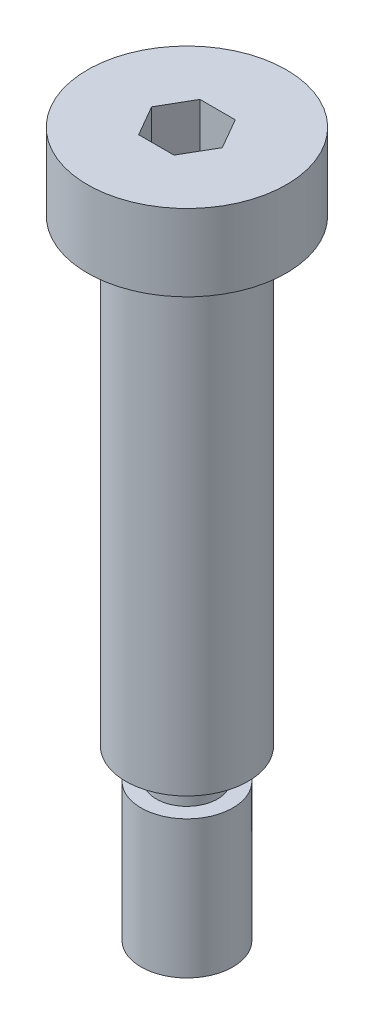
ISO-10303-21;
HEADER;
FILE_DESCRIPTION(('STEP AP214'),'2;1');
FILE_NAME('part.step','',(''),(''),'','','');
FILE_SCHEMA(('AUTOMOTIVE_DESIGN { 1 0 10303 214 1 1 1 1 }'));
ENDSEC;
DATA;
#1=APPLICATION_CONTEXT('core data for automotive mechanical design processes');
#2=APPLICATION_PROTOCOL_DEFINITION('international standard','automotive_design',2000,#1);
#3=PRODUCT_CONTEXT('',#1,'mechanical');
#4=PRODUCT('Part','Part','',(#3));
#5=PRODUCT_RELATED_PRODUCT_CATEGORY('part','',(#4));
#6=PRODUCT_DEFINITION_FORMATION('','',#4);
#7=PRODUCT_DEFINITION_CONTEXT('part definition',#1,'design');
#8=PRODUCT_DEFINITION('design','',#6,#7);
#9=PRODUCT_DEFINITION_SHAPE('','',#8);
#10=(LENGTH_UNIT() NAMED_UNIT(*) SI_UNIT(.MILLI.,.METRE.));
#11=(NAMED_UNIT(*) PLANE_ANGLE_UNIT() SI_UNIT($,.RADIAN.));
#12=(NAMED_UNIT(*) SI_UNIT($,.STERADIAN.) SOLID_ANGLE_UNIT());
#13=UNCERTAINTY_MEASURE_WITH_UNIT(LENGTH_MEASURE(1.E-05),#10,'distance_accuracy_value','');
#14=(GEOMETRIC_REPRESENTATION_CONTEXT(3) GLOBAL_UNCERTAINTY_ASSIGNED_CONTEXT((#13)) GLOBAL_UNIT_ASSIGNED_CONTEXT((#10,
#11,#12)) REPRESENTATION_CONTEXT('',''));
#15=CARTESIAN_POINT('',(0.,0.,0.));
#16=DIRECTION('',(0.,0.,1.));
#17=DIRECTION('',(1.,0.,0.));
#18=AXIS2_PLACEMENT_3D('',#15,#16,#17);
#19=CARTESIAN_POINT('',(0.,46.,0.));
#20=DIRECTION('',(0.,1.,0.));
#21=DIRECTION('',(0.,0.,1.));
#22=AXIS2_PLACEMENT_3D('',#19,#20,#21);
#23=PLANE('',#22);
#24=DIRECTION('',(-0.5,0.,-0.866025403784438));
#25=VECTOR('',#24,1.);
#26=CARTESIAN_POINT('',(2.3094010767585,46.,0.));
#27=LINE('',#26,#25);
#28=CARTESIAN_POINT('',(2.3094010767585,46.,0.));
#29=VERTEX_POINT('',#28);
#30=CARTESIAN_POINT('',(1.15470053837925,46.,-2.));
#31=VERTEX_POINT('',#30);
#32=EDGE_CURVE('E53',#29,#31,#27,.T.);
#33=ORIENTED_EDGE('',*,*,#32,.F.);
#34=DIRECTION('',(0.5,0.,-0.866025403784439));
#35=VECTOR('',#34,1.);
#36=CARTESIAN_POINT('',(1.15470053837925,46.,2.));
#37=LINE('',#36,#35);
#38=CARTESIAN_POINT('',(1.15470053837925,46.,2.));
#39=VERTEX_POINT('',#38);
#40=EDGE_CURVE('E136',#39,#29,#37,.T.);
#41=ORIENTED_EDGE('',*,*,#40,.F.);
#42=DIRECTION('',(1.,0.,0.));
#43=VECTOR('',#42,1.);
#44=CARTESIAN_POINT('',(-1.15470053837925,46.,2.));
#45=LINE('',#44,#43);
#46=CARTESIAN_POINT('',(-1.15470053837925,46.,2.));
#47=VERTEX_POINT('',#46);
#48=EDGE_CURVE('E134',#47,#39,#45,.T.);
#49=ORIENTED_EDGE('',*,*,#48,.F.);
#50=DIRECTION('',(0.5,0.,0.866025403784438));
#51=VECTOR('',#50,1.);
#52=CARTESIAN_POINT('',(-2.3094010767585,46.,0.));
#53=LINE('',#52,#51);
#54=CARTESIAN_POINT('',(-2.3094010767585,46.,0.));
#55=VERTEX_POINT('',#54);
#56=EDGE_CURVE('E101',#55,#47,#53,.T.);
#57=ORIENTED_EDGE('',*,*,#56,.F.);
#58=DIRECTION('',(-0.499999999999999,0.,0.866025403784439));
#59=VECTOR('',#58,1.);
#60=CARTESIAN_POINT('',(-1.15470053837925,46.,-2.));
#61=LINE('',#60,#59);
#62=CARTESIAN_POINT('',(-1.15470053837925,46.,-2.));
#63=VERTEX_POINT('',#62);
#64=EDGE_CURVE('E130',#63,#55,#61,.T.);
#65=ORIENTED_EDGE('',*,*,#64,.F.);
#66=DIRECTION('',(-1.,0.,0.));
#67=VECTOR('',#66,1.);
#68=CARTESIAN_POINT('',(1.15470053837925,46.,-2.));
#69=LINE('',#68,#67);
#70=EDGE_CURVE('E127',#31,#63,#69,.T.);
#71=ORIENTED_EDGE('',*,*,#70,.F.);
#72=EDGE_LOOP('',(#33,#41,#49,#57,#65,#71));
#73=FACE_BOUND('',#72,.T.);
#74=CARTESIAN_POINT('',(0.,46.,0.));
#75=DIRECTION('',(0.,-1.,0.));
#76=DIRECTION('',(0.,0.,-1.));
#77=AXIS2_PLACEMENT_3D('',#74,#75,#76);
#78=CIRCLE('',#77,6.5);
#79=CARTESIAN_POINT('',(0.,46.,-6.5));
#80=VERTEX_POINT('',#79);
#81=EDGE_CURVE('E11',#80,#80,#78,.T.);
#82=ORIENTED_EDGE('',*,*,#81,.F.);
#83=EDGE_LOOP('',(#82));
#84=FACE_BOUND('',#83,.T.);
#85=ADVANCED_FACE('F39',(#73,#84),#23,.T.);
#86=CARTESIAN_POINT('',(0.,0.,0.));
#87=DIRECTION('',(0.,-1.,0.));
#88=DIRECTION('',(0.,0.,-1.));
#89=AXIS2_PLACEMENT_3D('',#86,#87,#88);
#90=CYLINDRICAL_SURFACE('',#89,6.5);
#91=ORIENTED_EDGE('',*,*,#81,.T.);
#92=EDGE_LOOP('',(#91));
#93=FACE_BOUND('',#92,.T.);
#94=CARTESIAN_POINT('',(0.,41.,0.));
#95=DIRECTION('',(0.,-1.,0.));
#96=DIRECTION('',(0.,0.,-1.));
#97=AXIS2_PLACEMENT_3D('',#94,#95,#96);
#98=CIRCLE('',#97,6.5);
#99=CARTESIAN_POINT('',(0.,41.,-6.5));
#100=VERTEX_POINT('',#99);
#101=EDGE_CURVE('E46',#100,#100,#98,.T.);
#102=ORIENTED_EDGE('',*,*,#101,.F.);
#103=EDGE_LOOP('',(#102));
#104=FACE_BOUND('',#103,.T.);
#105=ADVANCED_FACE('F168',(#93,#104),#90,.T.);
#106=CARTESIAN_POINT('',(6.5,41.,0.));
#107=DIRECTION('',(0.,-1.,0.));
#108=DIRECTION('',(0.,0.,-1.));
#109=AXIS2_PLACEMENT_3D('',#106,#107,#108);
#110=PLANE('',#109);
#111=ORIENTED_EDGE('',*,*,#101,.T.);
#112=EDGE_LOOP('',(#111));
#113=FACE_BOUND('',#112,.T.);
#114=CARTESIAN_POINT('',(0.,41.,0.));
#115=DIRECTION('',(0.,-1.,0.));
#116=DIRECTION('',(0.,0.,-1.));
#117=AXIS2_PLACEMENT_3D('',#114,#115,#116);
#118=CIRCLE('',#117,4.);
#119=CARTESIAN_POINT('',(0.,41.,-4.));
#120=VERTEX_POINT('',#119);
#121=EDGE_CURVE('E160',#120,#120,#118,.T.);
#122=ORIENTED_EDGE('',*,*,#121,.F.);
#123=EDGE_LOOP('',(#122));
#124=FACE_BOUND('',#123,.T.);
#125=ADVANCED_FACE('F165',(#113,#124),#110,.T.);
#126=CARTESIAN_POINT('',(0.,0.,0.));
#127=DIRECTION('',(0.,-1.,0.));
#128=DIRECTION('',(0.,0.,-1.));
#129=AXIS2_PLACEMENT_3D('',#126,#127,#128);
#130=CYLINDRICAL_SURFACE('',#129,4.);
#131=ORIENTED_EDGE('',*,*,#121,.T.);
#132=EDGE_LOOP('',(#131));
#133=FACE_BOUND('',#132,.T.);
#134=CARTESIAN_POINT('',(0.,11.,0.));
#135=DIRECTION('',(0.,-1.,0.));
#136=DIRECTION('',(0.,0.,-1.));
#137=AXIS2_PLACEMENT_3D('',#134,#135,#136);
#138=CIRCLE('',#137,4.);
#139=CARTESIAN_POINT('',(0.,11.,-4.));
#140=VERTEX_POINT('',#139);
#141=EDGE_CURVE('E157',#140,#140,#138,.T.);
#142=ORIENTED_EDGE('',*,*,#141,.F.);
#143=EDGE_LOOP('',(#142));
#144=FACE_BOUND('',#143,.T.);
#145=ADVANCED_FACE('F174',(#133,#144),#130,.T.);
#146=CARTESIAN_POINT('',(4.,11.,0.));
#147=DIRECTION('',(0.,-1.,0.));
#148=DIRECTION('',(0.,0.,-1.));
#149=AXIS2_PLACEMENT_3D('',#146,#147,#148);
#150=PLANE('',#149);
#151=ORIENTED_EDGE('',*,*,#141,.T.);
#152=EDGE_LOOP('',(#151));
#153=FACE_BOUND('',#152,.T.);
#154=CARTESIAN_POINT('',(0.,11.,0.));
#155=DIRECTION('',(0.,-1.,0.));
#156=DIRECTION('',(0.,0.,-1.));
#157=AXIS2_PLACEMENT_3D('',#154,#155,#156);
#158=CIRCLE('',#157,2.);
#159=CARTESIAN_POINT('',(0.,11.,-2.));
#160=VERTEX_POINT('',#159);
#161=EDGE_CURVE('E154',#160,#160,#158,.T.);
#162=ORIENTED_EDGE('',*,*,#161,.F.);
#163=EDGE_LOOP('',(#162));
#164=FACE_BOUND('',#163,.T.);
#165=ADVANCED_FACE('F181',(#153,#164),#150,.T.);
#166=CARTESIAN_POINT('',(0.,0.,0.));
#167=DIRECTION('',(0.,-1.,0.));
#168=DIRECTION('',(0.,0.,-1.));
#169=AXIS2_PLACEMENT_3D('',#166,#167,#168);
#170=CYLINDRICAL_SURFACE('',#169,2.);
#171=ORIENTED_EDGE('',*,*,#161,.T.);
#172=EDGE_LOOP('',(#171));
#173=FACE_BOUND('',#172,.T.);
#174=CARTESIAN_POINT('',(0.,9.,0.));
#175=DIRECTION('',(0.,-1.,0.));
#176=DIRECTION('',(0.,0.,-1.));
#177=AXIS2_PLACEMENT_3D('',#174,#175,#176);
#178=CIRCLE('',#177,2.);
#179=CARTESIAN_POINT('',(0.,9.,-2.));
#180=VERTEX_POINT('',#179);
#181=EDGE_CURVE('E151',#180,#180,#178,.T.);
#182=ORIENTED_EDGE('',*,*,#181,.F.);
#183=EDGE_LOOP('',(#182));
#184=FACE_BOUND('',#183,.T.);
#185=ADVANCED_FACE('F185',(#173,#184),#170,.T.);
#186=CARTESIAN_POINT('',(2.,9.,0.));
#187=DIRECTION('',(0.,1.,0.));
#188=DIRECTION('',(0.,0.,1.));
#189=AXIS2_PLACEMENT_3D('',#186,#187,#188);
#190=PLANE('',#189);
#191=ORIENTED_EDGE('',*,*,#181,.T.);
#192=EDGE_LOOP('',(#191));
#193=FACE_BOUND('',#192,.T.);
#194=CARTESIAN_POINT('',(0.,9.,0.));
#195=DIRECTION('',(0.,-1.,0.));
#196=DIRECTION('',(0.,0.,-1.));
#197=AXIS2_PLACEMENT_3D('',#194,#195,#196);
#198=CIRCLE('',#197,3.);
#199=CARTESIAN_POINT('',(0.,9.,-3.));
#200=VERTEX_POINT('',#199);
#201=EDGE_CURVE('E148',#200,#200,#198,.T.);
#202=ORIENTED_EDGE('',*,*,#201,.F.);
#203=EDGE_LOOP('',(#202));
#204=FACE_BOUND('',#203,.T.);
#205=ADVANCED_FACE('F189',(#193,#204),#190,.T.);
#206=CARTESIAN_POINT('',(0.,0.,0.));
#207=DIRECTION('',(0.,-1.,0.));
#208=DIRECTION('',(0.,0.,-1.));
#209=AXIS2_PLACEMENT_3D('',#206,#207,#208);
#210=CYLINDRICAL_SURFACE('',#209,3.);
#211=ORIENTED_EDGE('',*,*,#201,.T.);
#212=EDGE_LOOP('',(#211));
#213=FACE_BOUND('',#212,.T.);
#214=CARTESIAN_POINT('',(0.,0.,0.));
#215=DIRECTION('',(0.,-1.,0.));
#216=DIRECTION('',(0.,0.,-1.));
#217=AXIS2_PLACEMENT_3D('',#214,#215,#216);
#218=CIRCLE('',#217,3.);
#219=CARTESIAN_POINT('',(0.,0.,-3.));
#220=VERTEX_POINT('',#219);
#221=EDGE_CURVE('E140',#220,#220,#218,.T.);
#222=ORIENTED_EDGE('',*,*,#221,.F.);
#223=EDGE_LOOP('',(#222));
#224=FACE_BOUND('',#223,.T.);
#225=ADVANCED_FACE('F193',(#213,#224),#210,.T.);
#226=CARTESIAN_POINT('',(3.,0.,0.));
#227=DIRECTION('',(0.,-1.,0.));
#228=DIRECTION('',(0.,0.,-1.));
#229=AXIS2_PLACEMENT_3D('',#226,#227,#228);
#230=PLANE('',#229);
#231=ORIENTED_EDGE('',*,*,#221,.T.);
#232=EDGE_LOOP('',(#231));
#233=FACE_BOUND('',#232,.T.);
#234=ADVANCED_FACE('F197',(#233),#230,.T.);
#235=CARTESIAN_POINT('',(2.3094010767585,43.,0.));
#236=DIRECTION('',(0.866025403784438,0.,-0.5));
#237=DIRECTION('',(-0.5,0.,-0.866025403784438));
#238=AXIS2_PLACEMENT_3D('',#235,#236,#237);
#239=PLANE('',#238);
#240=ORIENTED_EDGE('',*,*,#32,.T.);
#241=DIRECTION('',(0.,1.,0.));
#242=VECTOR('',#241,1.);
#243=CARTESIAN_POINT('',(1.15470053837925,43.,-2.));
#244=LINE('',#243,#242);
#245=CARTESIAN_POINT('',(1.15470053837925,43.,-2.));
#246=VERTEX_POINT('',#245);
#247=EDGE_CURVE('E83',#246,#31,#244,.T.);
#248=ORIENTED_EDGE('',*,*,#247,.F.);
#249=DIRECTION('',(-0.5,0.,-0.866025403784438));
#250=VECTOR('',#249,1.);
#251=CARTESIAN_POINT('',(2.3094010767585,43.,0.));
#252=LINE('',#251,#250);
#253=CARTESIAN_POINT('',(2.3094010767585,43.,0.));
#254=VERTEX_POINT('',#253);
#255=EDGE_CURVE('E138',#254,#246,#252,.T.);
#256=ORIENTED_EDGE('',*,*,#255,.F.);
#257=DIRECTION('',(0.,1.,0.));
#258=VECTOR('',#257,1.);
#259=CARTESIAN_POINT('',(2.3094010767585,43.,0.));
#260=LINE('',#259,#258);
#261=EDGE_CURVE('E61',#254,#29,#260,.T.);
#262=ORIENTED_EDGE('',*,*,#261,.T.);
#263=EDGE_LOOP('',(#240,#248,#256,#262));
#264=FACE_BOUND('',#263,.T.);
#265=ADVANCED_FACE('F201',(#264),#239,.F.);
#266=CARTESIAN_POINT('',(1.15470053837925,43.,2.));
#267=DIRECTION('',(0.866025403784439,0.,0.5));
#268=DIRECTION('',(0.5,0.,-0.866025403784439));
#269=AXIS2_PLACEMENT_3D('',#266,#267,#268);
#270=PLANE('',#269);
#271=ORIENTED_EDGE('',*,*,#40,.T.);
#272=ORIENTED_EDGE('',*,*,#261,.F.);
#273=DIRECTION('',(0.5,0.,-0.866025403784439));
#274=VECTOR('',#273,1.);
#275=CARTESIAN_POINT('',(1.15470053837925,43.,2.));
#276=LINE('',#275,#274);
#277=CARTESIAN_POINT('',(1.15470053837925,43.,2.));
#278=VERTEX_POINT('',#277);
#279=EDGE_CURVE('E113',#278,#254,#276,.T.);
#280=ORIENTED_EDGE('',*,*,#279,.F.);
#281=DIRECTION('',(0.,1.,0.));
#282=VECTOR('',#281,1.);
#283=CARTESIAN_POINT('',(1.15470053837925,43.,2.));
#284=LINE('',#283,#282);
#285=EDGE_CURVE('E105',#278,#39,#284,.T.);
#286=ORIENTED_EDGE('',*,*,#285,.T.);
#287=EDGE_LOOP('',(#271,#272,#280,#286));
#288=FACE_BOUND('',#287,.T.);
#289=ADVANCED_FACE('F205',(#288),#270,.F.);
#290=CARTESIAN_POINT('',(-1.15470053837925,43.,2.));
#291=DIRECTION('',(0.,0.,1.));
#292=DIRECTION('',(1.,0.,0.));
#293=AXIS2_PLACEMENT_3D('',#290,#291,#292);
#294=PLANE('',#293);
#295=ORIENTED_EDGE('',*,*,#48,.T.);
#296=ORIENTED_EDGE('',*,*,#285,.F.);
#297=DIRECTION('',(1.,0.,0.));
#298=VECTOR('',#297,1.);
#299=CARTESIAN_POINT('',(-1.15470053837925,43.,2.));
#300=LINE('',#299,#298);
#301=CARTESIAN_POINT('',(-1.15470053837925,43.,2.));
#302=VERTEX_POINT('',#301);
#303=EDGE_CURVE('E109',#302,#278,#300,.T.);
#304=ORIENTED_EDGE('',*,*,#303,.F.);
#305=DIRECTION('',(0.,1.,0.));
#306=VECTOR('',#305,1.);
#307=CARTESIAN_POINT('',(-1.15470053837925,43.,2.));
#308=LINE('',#307,#306);
#309=EDGE_CURVE('E94',#302,#47,#308,.T.);
#310=ORIENTED_EDGE('',*,*,#309,.T.);
#311=EDGE_LOOP('',(#295,#296,#304,#310));
#312=FACE_BOUND('',#311,.T.);
#313=ADVANCED_FACE('F110',(#312),#294,.F.);
#314=CARTESIAN_POINT('',(-2.3094010767585,43.,0.));
#315=DIRECTION('',(-0.866025403784438,0.,0.5));
#316=DIRECTION('',(0.5,0.,0.866025403784439));
#317=AXIS2_PLACEMENT_3D('',#314,#315,#316);
#318=PLANE('',#317);
#319=ORIENTED_EDGE('',*,*,#56,.T.);
#320=ORIENTED_EDGE('',*,*,#309,.F.);
#321=DIRECTION('',(0.5,0.,0.866025403784438));
#322=VECTOR('',#321,1.);
#323=CARTESIAN_POINT('',(-2.3094010767585,43.,0.));
#324=LINE('',#323,#322);
#325=CARTESIAN_POINT('',(-2.3094010767585,43.,0.));
#326=VERTEX_POINT('',#325);
#327=EDGE_CURVE('E98',#326,#302,#324,.T.);
#328=ORIENTED_EDGE('',*,*,#327,.F.);
#329=DIRECTION('',(0.,1.,0.));
#330=VECTOR('',#329,1.);
#331=CARTESIAN_POINT('',(-2.3094010767585,43.,0.));
#332=LINE('',#331,#330);
#333=EDGE_CURVE('E106',#326,#55,#332,.T.);
#334=ORIENTED_EDGE('',*,*,#333,.T.);
#335=EDGE_LOOP('',(#319,#320,#328,#334));
#336=FACE_BOUND('',#335,.T.);
#337=ADVANCED_FACE('F96',(#336),#318,.F.);
#338=CARTESIAN_POINT('',(-1.15470053837925,43.,-2.));
#339=DIRECTION('',(-0.866025403784439,0.,-0.5));
#340=DIRECTION('',(-0.5,0.,0.866025403784439));
#341=AXIS2_PLACEMENT_3D('',#338,#339,#340);
#342=PLANE('',#341);
#343=ORIENTED_EDGE('',*,*,#64,.T.);
#344=ORIENTED_EDGE('',*,*,#333,.F.);
#345=DIRECTION('',(-0.499999999999999,0.,0.866025403784439));
#346=VECTOR('',#345,1.);
#347=CARTESIAN_POINT('',(-1.15470053837925,43.,-2.));
#348=LINE('',#347,#346);
#349=CARTESIAN_POINT('',(-1.15470053837925,43.,-2.));
#350=VERTEX_POINT('',#349);
#351=EDGE_CURVE('E119',#350,#326,#348,.T.);
#352=ORIENTED_EDGE('',*,*,#351,.F.);
#353=DIRECTION('',(0.,1.,0.));
#354=VECTOR('',#353,1.);
#355=CARTESIAN_POINT('',(-1.15470053837925,43.,-2.));
#356=LINE('',#355,#354);
#357=EDGE_CURVE('E143',#350,#63,#356,.T.);
#358=ORIENTED_EDGE('',*,*,#357,.T.);
#359=EDGE_LOOP('',(#343,#344,#352,#358));
#360=FACE_BOUND('',#359,.T.);
#361=ADVANCED_FACE('F209',(#360),#342,.F.);
#362=CARTESIAN_POINT('',(1.15470053837925,43.,-2.));
#363=DIRECTION('',(0.,0.,-1.));
#364=DIRECTION('',(-1.,0.,0.));
#365=AXIS2_PLACEMENT_3D('',#362,#363,#364);
#366=PLANE('',#365);
#367=ORIENTED_EDGE('',*,*,#70,.T.);
#368=ORIENTED_EDGE('',*,*,#357,.F.);
#369=DIRECTION('',(-1.,0.,0.));
#370=VECTOR('',#369,1.);
#371=CARTESIAN_POINT('',(1.15470053837925,43.,-2.));
#372=LINE('',#371,#370);
#373=EDGE_CURVE('E121',#246,#350,#372,.T.);
#374=ORIENTED_EDGE('',*,*,#373,.F.);
#375=ORIENTED_EDGE('',*,*,#247,.T.);
#376=EDGE_LOOP('',(#367,#368,#374,#375));
#377=FACE_BOUND('',#376,.T.);
#378=ADVANCED_FACE('F206',(#377),#366,.F.);
#379=CARTESIAN_POINT('',(0.,43.,0.));
#380=DIRECTION('',(0.,1.,0.));
#381=DIRECTION('',(0.,0.,1.));
#382=AXIS2_PLACEMENT_3D('',#379,#380,#381);
#383=PLANE('',#382);
#384=ORIENTED_EDGE('',*,*,#255,.T.);
#385=ORIENTED_EDGE('',*,*,#373,.T.);
#386=ORIENTED_EDGE('',*,*,#351,.T.);
#387=ORIENTED_EDGE('',*,*,#327,.T.);
#388=ORIENTED_EDGE('',*,*,#303,.T.);
#389=ORIENTED_EDGE('',*,*,#279,.T.);
#390=EDGE_LOOP('',(#384,#385,#386,#387,#388,#389));
#391=FACE_BOUND('',#390,.T.);
#392=ADVANCED_FACE('F116',(#391),#383,.T.);
#393=CLOSED_SHELL('',(#85,#105,#125,#145,#165,#185,#205,#225,#234,#265,#289,#313,#337,#361,#378,#392));
#394=MANIFOLD_SOLID_BREP('B2',#393);
#395=ADVANCED_BREP_SHAPE_REPRESENTATION('',(#18,#394),#14);
#396=SHAPE_DEFINITION_REPRESENTATION(#9,#395);
ENDSEC;
END-ISO-10303-21;
